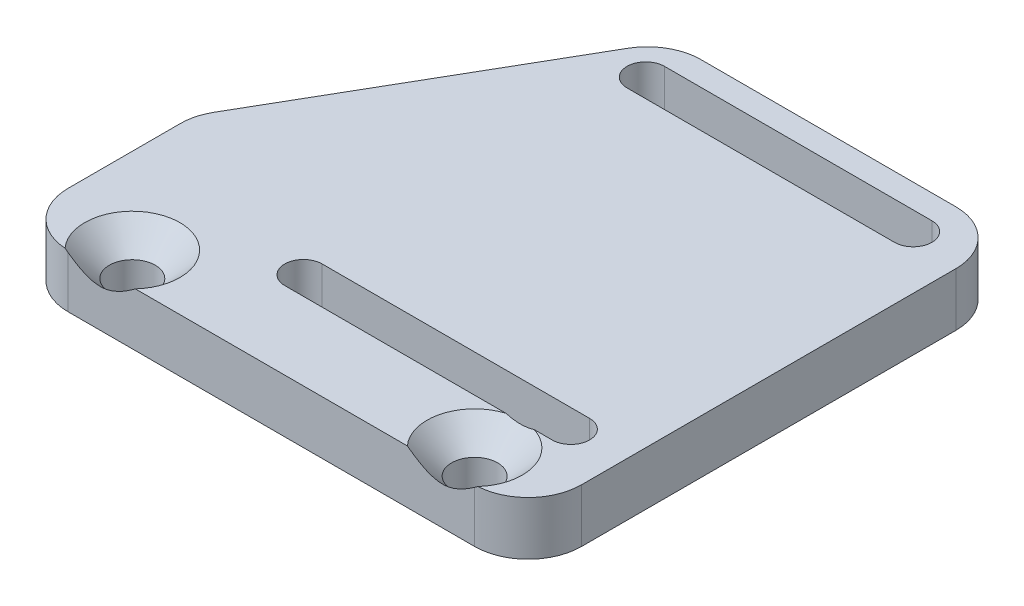
ISO-10303-21;
HEADER;
FILE_DESCRIPTION(('STEP AP214'),'2;1');
FILE_NAME('part.step','',(''),(''),'','','');
FILE_SCHEMA(('AUTOMOTIVE_DESIGN { 1 0 10303 214 1 1 1 1 }'));
ENDSEC;
DATA;
#1=APPLICATION_CONTEXT('core data for automotive mechanical design processes');
#2=APPLICATION_PROTOCOL_DEFINITION('international standard','automotive_design',2000,#1);
#3=PRODUCT_CONTEXT('',#1,'mechanical');
#4=PRODUCT('Part','Part','',(#3));
#5=PRODUCT_RELATED_PRODUCT_CATEGORY('part','',(#4));
#6=PRODUCT_DEFINITION_FORMATION('','',#4);
#7=PRODUCT_DEFINITION_CONTEXT('part definition',#1,'design');
#8=PRODUCT_DEFINITION('design','',#6,#7);
#9=PRODUCT_DEFINITION_SHAPE('','',#8);
#10=(LENGTH_UNIT() NAMED_UNIT(*) SI_UNIT(.MILLI.,.METRE.));
#11=(NAMED_UNIT(*) PLANE_ANGLE_UNIT() SI_UNIT($,.RADIAN.));
#12=(NAMED_UNIT(*) SI_UNIT($,.STERADIAN.) SOLID_ANGLE_UNIT());
#13=UNCERTAINTY_MEASURE_WITH_UNIT(LENGTH_MEASURE(1.E-05),#10,'distance_accuracy_value','');
#14=(GEOMETRIC_REPRESENTATION_CONTEXT(3) GLOBAL_UNCERTAINTY_ASSIGNED_CONTEXT((#13)) GLOBAL_UNIT_ASSIGNED_CONTEXT((#10,
#11,#12)) REPRESENTATION_CONTEXT('',''));
#15=CARTESIAN_POINT('',(0.,0.,0.));
#16=DIRECTION('',(0.,0.,1.));
#17=DIRECTION('',(1.,0.,0.));
#18=AXIS2_PLACEMENT_3D('',#15,#16,#17);
#19=CARTESIAN_POINT('',(0.,5.,0.));
#20=DIRECTION('',(0.,1.,0.));
#21=DIRECTION('',(0.,0.,1.));
#22=AXIS2_PLACEMENT_3D('',#19,#20,#21);
#23=PLANE('',#22);
#24=DIRECTION('',(1.,0.,0.));
#25=VECTOR('',#24,1.);
#26=CARTESIAN_POINT('',(-30.,5.,-7.24999999999999));
#27=LINE('',#26,#25);
#28=CARTESIAN_POINT('',(-6.68090940417267,5.,-7.25));
#29=VERTEX_POINT('',#28);
#30=CARTESIAN_POINT('',(-5.,5.,-7.25));
#31=VERTEX_POINT('',#30);
#32=EDGE_CURVE('E261',#29,#31,#27,.T.);
#33=ORIENTED_EDGE('',*,*,#32,.F.);
#34=CARTESIAN_POINT('',(-8.,5.,-2.99999999999999));
#35=DIRECTION('',(0.,1.,0.));
#36=DIRECTION('',(0.,0.,1.));
#37=AXIS2_PLACEMENT_3D('',#34,#35,#36);
#38=CIRCLE('',#37,4.45000000000002);
#39=CARTESIAN_POINT('',(-4.70537528035909,5.,-0.00868792053867681));
#40=VERTEX_POINT('',#39);
#41=EDGE_CURVE('E418',#29,#40,#38,.F.);
#42=ORIENTED_EDGE('',*,*,#41,.T.);
#43=CARTESIAN_POINT('',(-5.,5.,-5.));
#44=DIRECTION('',(0.,1.,0.));
#45=DIRECTION('',(0.,0.,1.));
#46=AXIS2_PLACEMENT_3D('',#43,#44,#45);
#47=CIRCLE('',#46,5.);
#48=CARTESIAN_POINT('',(0.,5.,-5.));
#49=VERTEX_POINT('',#48);
#50=EDGE_CURVE('E360',#40,#49,#47,.T.);
#51=ORIENTED_EDGE('',*,*,#50,.T.);
#52=DIRECTION('',(0.,0.,-1.));
#53=VECTOR('',#52,1.);
#54=CARTESIAN_POINT('',(0.,5.,0.));
#55=LINE('',#54,#53);
#56=CARTESIAN_POINT('',(0.,5.,-40.));
#57=VERTEX_POINT('',#56);
#58=EDGE_CURVE('E311',#49,#57,#55,.T.);
#59=ORIENTED_EDGE('',*,*,#58,.T.);
#60=CARTESIAN_POINT('',(-5.,5.,-40.));
#61=DIRECTION('',(0.,1.,0.));
#62=DIRECTION('',(0.,0.,1.));
#63=AXIS2_PLACEMENT_3D('',#60,#61,#62);
#64=CIRCLE('',#63,5.);
#65=CARTESIAN_POINT('',(-5.,5.,-45.));
#66=VERTEX_POINT('',#65);
#67=EDGE_CURVE('E350',#57,#66,#64,.T.);
#68=ORIENTED_EDGE('',*,*,#67,.T.);
#69=DIRECTION('',(-1.,0.,0.));
#70=VECTOR('',#69,1.);
#71=CARTESIAN_POINT('',(0.,5.,-45.));
#72=LINE('',#71,#70);
#73=CARTESIAN_POINT('',(-28.8452994616208,5.,-45.));
#74=VERTEX_POINT('',#73);
#75=EDGE_CURVE('E315',#66,#74,#72,.T.);
#76=ORIENTED_EDGE('',*,*,#75,.T.);
#77=CARTESIAN_POINT('',(-28.8452994616208,5.,-40.));
#78=DIRECTION('',(0.,1.,0.));
#79=DIRECTION('',(0.,0.,1.));
#80=AXIS2_PLACEMENT_3D('',#77,#78,#79);
#81=CIRCLE('',#80,5.);
#82=CARTESIAN_POINT('',(-33.1754264805429,5.,-42.5));
#83=VERTEX_POINT('',#82);
#84=EDGE_CURVE('E363',#74,#83,#81,.T.);
#85=ORIENTED_EDGE('',*,*,#84,.T.);
#86=DIRECTION('',(0.500000000000004,0.,-0.866025403784436));
#87=VECTOR('',#86,1.);
#88=CARTESIAN_POINT('',(-43.2846096908265,5.,-24.9903810567668));
#89=LINE('',#88,#87);
#90=CARTESIAN_POINT('',(-47.3301270189222,5.,-17.9833395016049));
#91=VERTEX_POINT('',#90);
#92=EDGE_CURVE('E241',#91,#83,#89,.T.);
#93=ORIENTED_EDGE('',*,*,#92,.F.);
#94=CARTESIAN_POINT('',(-43.,5.,-15.4833395016049));
#95=DIRECTION('',(0.,1.,0.));
#96=DIRECTION('',(0.,0.,1.));
#97=AXIS2_PLACEMENT_3D('',#94,#95,#96);
#98=CIRCLE('',#97,5.);
#99=CARTESIAN_POINT('',(-48.,5.,-15.4833395016049));
#100=VERTEX_POINT('',#99);
#101=EDGE_CURVE('E353',#91,#100,#98,.T.);
#102=ORIENTED_EDGE('',*,*,#101,.T.);
#103=DIRECTION('',(0.,0.,1.));
#104=VECTOR('',#103,1.);
#105=CARTESIAN_POINT('',(-48.,5.,0.));
#106=LINE('',#105,#104);
#107=CARTESIAN_POINT('',(-48.,5.,-4.99999999999999));
#108=VERTEX_POINT('',#107);
#109=EDGE_CURVE('E320',#100,#108,#106,.T.);
#110=ORIENTED_EDGE('',*,*,#109,.T.);
#111=CARTESIAN_POINT('',(-43.,5.,-4.99999999999999));
#112=DIRECTION('',(0.,1.,0.));
#113=DIRECTION('',(0.,0.,1.));
#114=AXIS2_PLACEMENT_3D('',#111,#112,#113);
#115=CIRCLE('',#114,5.);
#116=CARTESIAN_POINT('',(-43.2946247196409,5.,-0.00868792053867074));
#117=VERTEX_POINT('',#116);
#118=EDGE_CURVE('E356',#108,#117,#115,.T.);
#119=ORIENTED_EDGE('',*,*,#118,.T.);
#120=CARTESIAN_POINT('',(-40.,5.,-2.99999999999999));
#121=DIRECTION('',(0.,1.,0.));
#122=DIRECTION('',(0.,0.,1.));
#123=AXIS2_PLACEMENT_3D('',#120,#121,#122);
#124=CIRCLE('',#123,4.45000000000001);
#125=CARTESIAN_POINT('',(-36.713284314091,5.,0.));
#126=VERTEX_POINT('',#125);
#127=EDGE_CURVE('E411',#117,#126,#124,.F.);
#128=ORIENTED_EDGE('',*,*,#127,.T.);
#129=DIRECTION('',(1.,0.,0.));
#130=VECTOR('',#129,1.);
#131=CARTESIAN_POINT('',(0.,5.,0.));
#132=LINE('',#131,#130);
#133=CARTESIAN_POINT('',(-11.286715685909,5.,0.));
#134=VERTEX_POINT('',#133);
#135=EDGE_CURVE('E324',#126,#134,#132,.T.);
#136=ORIENTED_EDGE('',*,*,#135,.T.);
#137=CARTESIAN_POINT('',(-8.,5.,-2.99999999999999));
#138=DIRECTION('',(0.,1.,0.));
#139=DIRECTION('',(0.,0.,1.));
#140=AXIS2_PLACEMENT_3D('',#137,#138,#139);
#141=CIRCLE('',#140,4.45000000000002);
#142=CARTESIAN_POINT('',(-9.31909059582734,5.,-7.25));
#143=VERTEX_POINT('',#142);
#144=EDGE_CURVE('E415',#134,#143,#141,.F.);
#145=ORIENTED_EDGE('',*,*,#144,.T.);
#146=CARTESIAN_POINT('',(-30.,5.,-7.24999999999999));
#147=VERTEX_POINT('',#146);
#148=EDGE_CURVE('E263',#147,#143,#27,.T.);
#149=ORIENTED_EDGE('',*,*,#148,.F.);
#150=CARTESIAN_POINT('',(-30.,5.,-8.99999999999999));
#151=DIRECTION('',(0.,1.,0.));
#152=DIRECTION('',(0.,0.,1.));
#153=AXIS2_PLACEMENT_3D('',#150,#151,#152);
#154=CIRCLE('',#153,1.75);
#155=CARTESIAN_POINT('',(-30.,5.,-10.75));
#156=VERTEX_POINT('',#155);
#157=EDGE_CURVE('E258',#156,#147,#154,.T.);
#158=ORIENTED_EDGE('',*,*,#157,.F.);
#159=DIRECTION('',(-1.,0.,0.));
#160=VECTOR('',#159,1.);
#161=CARTESIAN_POINT('',(-30.,5.,-10.75));
#162=LINE('',#161,#160);
#163=CARTESIAN_POINT('',(-5.,5.,-10.75));
#164=VERTEX_POINT('',#163);
#165=EDGE_CURVE('E271',#164,#156,#162,.T.);
#166=ORIENTED_EDGE('',*,*,#165,.F.);
#167=CARTESIAN_POINT('',(-5.,5.,-9.));
#168=DIRECTION('',(0.,1.,0.));
#169=DIRECTION('',(0.,0.,1.));
#170=AXIS2_PLACEMENT_3D('',#167,#168,#169);
#171=CIRCLE('',#170,1.75);
#172=EDGE_CURVE('E267',#31,#164,#171,.T.);
#173=ORIENTED_EDGE('',*,*,#172,.F.);
#174=EDGE_LOOP('',(#33,#42,#51,#59,#68,#76,#85,#93,#102,#110,#119,#128,#136,#145,#149,#158,#166,#173));
#175=FACE_BOUND('',#174,.T.);
#176=DIRECTION('',(1.,0.,0.));
#177=VECTOR('',#176,1.);
#178=CARTESIAN_POINT('',(-30.,5.,-39.25));
#179=LINE('',#178,#177);
#180=CARTESIAN_POINT('',(-30.,5.,-39.25));
#181=VERTEX_POINT('',#180);
#182=CARTESIAN_POINT('',(-5.00000000000001,5.,-39.25));
#183=VERTEX_POINT('',#182);
#184=EDGE_CURVE('E214',#181,#183,#179,.T.);
#185=ORIENTED_EDGE('',*,*,#184,.F.);
#186=CARTESIAN_POINT('',(-30.,5.,-41.));
#187=DIRECTION('',(0.,1.,0.));
#188=DIRECTION('',(0.,0.,1.));
#189=AXIS2_PLACEMENT_3D('',#186,#187,#188);
#190=CIRCLE('',#189,1.75);
#191=CARTESIAN_POINT('',(-30.,5.,-42.75));
#192=VERTEX_POINT('',#191);
#193=EDGE_CURVE('E203',#192,#181,#190,.T.);
#194=ORIENTED_EDGE('',*,*,#193,.F.);
#195=DIRECTION('',(-1.,0.,0.));
#196=VECTOR('',#195,1.);
#197=CARTESIAN_POINT('',(-30.,5.,-42.75));
#198=LINE('',#197,#196);
#199=CARTESIAN_POINT('',(-5.00000000000001,5.,-42.75));
#200=VERTEX_POINT('',#199);
#201=EDGE_CURVE('E232',#200,#192,#198,.T.);
#202=ORIENTED_EDGE('',*,*,#201,.F.);
#203=CARTESIAN_POINT('',(-5.00000000000001,5.,-41.));
#204=DIRECTION('',(0.,1.,0.));
#205=DIRECTION('',(0.,0.,1.));
#206=AXIS2_PLACEMENT_3D('',#203,#204,#205);
#207=CIRCLE('',#206,1.75);
#208=EDGE_CURVE('E228',#183,#200,#207,.T.);
#209=ORIENTED_EDGE('',*,*,#208,.F.);
#210=EDGE_LOOP('',(#185,#194,#202,#209));
#211=FACE_BOUND('',#210,.T.);
#212=ADVANCED_FACE('F51',(#175,#211),#23,.T.);
#213=CARTESIAN_POINT('',(0.,0.,0.));
#214=DIRECTION('',(0.,1.,0.));
#215=DIRECTION('',(0.,0.,1.));
#216=AXIS2_PLACEMENT_3D('',#213,#214,#215);
#217=PLANE('',#216);
#218=CARTESIAN_POINT('',(-30.,0.,-8.99999999999999));
#219=DIRECTION('',(0.,1.,0.));
#220=DIRECTION('',(0.,0.,1.));
#221=AXIS2_PLACEMENT_3D('',#218,#219,#220);
#222=CIRCLE('',#221,1.75);
#223=CARTESIAN_POINT('',(-30.,0.,-10.75));
#224=VERTEX_POINT('',#223);
#225=CARTESIAN_POINT('',(-30.,0.,-7.24999999999999));
#226=VERTEX_POINT('',#225);
#227=EDGE_CURVE('E223',#224,#226,#222,.T.);
#228=ORIENTED_EDGE('',*,*,#227,.T.);
#229=DIRECTION('',(1.,0.,0.));
#230=VECTOR('',#229,1.);
#231=CARTESIAN_POINT('',(-30.,0.,-7.24999999999999));
#232=LINE('',#231,#230);
#233=CARTESIAN_POINT('',(-5.,0.,-7.25));
#234=VERTEX_POINT('',#233);
#235=EDGE_CURVE('E278',#226,#234,#232,.T.);
#236=ORIENTED_EDGE('',*,*,#235,.T.);
#237=CARTESIAN_POINT('',(-5.,0.,-9.));
#238=DIRECTION('',(0.,1.,0.));
#239=DIRECTION('',(0.,0.,1.));
#240=AXIS2_PLACEMENT_3D('',#237,#238,#239);
#241=CIRCLE('',#240,1.75);
#242=CARTESIAN_POINT('',(-5.,0.,-10.75));
#243=VERTEX_POINT('',#242);
#244=EDGE_CURVE('E282',#234,#243,#241,.T.);
#245=ORIENTED_EDGE('',*,*,#244,.T.);
#246=DIRECTION('',(-1.,0.,0.));
#247=VECTOR('',#246,1.);
#248=CARTESIAN_POINT('',(-30.,0.,-10.75));
#249=LINE('',#248,#247);
#250=EDGE_CURVE('E262',#243,#224,#249,.T.);
#251=ORIENTED_EDGE('',*,*,#250,.T.);
#252=EDGE_LOOP('',(#228,#236,#245,#251));
#253=FACE_BOUND('',#252,.T.);
#254=DIRECTION('',(0.500000000000004,0.,-0.866025403784436));
#255=VECTOR('',#254,1.);
#256=CARTESIAN_POINT('',(-31.7320508075689,0.,-45.));
#257=LINE('',#256,#255);
#258=CARTESIAN_POINT('',(-47.3301270189222,0.,-17.9833395016049));
#259=VERTEX_POINT('',#258);
#260=CARTESIAN_POINT('',(-33.1754264805429,0.,-42.5));
#261=VERTEX_POINT('',#260);
#262=EDGE_CURVE('E663',#259,#261,#257,.T.);
#263=ORIENTED_EDGE('',*,*,#262,.T.);
#264=CARTESIAN_POINT('',(-28.8452994616208,0.,-40.));
#265=DIRECTION('',(0.,1.,0.));
#266=DIRECTION('',(0.,0.,1.));
#267=AXIS2_PLACEMENT_3D('',#264,#265,#266);
#268=CIRCLE('',#267,5.);
#269=CARTESIAN_POINT('',(-28.8452994616208,0.,-45.));
#270=VERTEX_POINT('',#269);
#271=EDGE_CURVE('E385',#261,#270,#268,.F.);
#272=ORIENTED_EDGE('',*,*,#271,.T.);
#273=DIRECTION('',(-1.,0.,0.));
#274=VECTOR('',#273,1.);
#275=CARTESIAN_POINT('',(0.,0.,-45.));
#276=LINE('',#275,#274);
#277=CARTESIAN_POINT('',(-5.,0.,-45.));
#278=VERTEX_POINT('',#277);
#279=EDGE_CURVE('E332',#278,#270,#276,.T.);
#280=ORIENTED_EDGE('',*,*,#279,.F.);
#281=CARTESIAN_POINT('',(-5.,0.,-40.));
#282=DIRECTION('',(0.,1.,0.));
#283=DIRECTION('',(0.,0.,1.));
#284=AXIS2_PLACEMENT_3D('',#281,#282,#283);
#285=CIRCLE('',#284,5.);
#286=CARTESIAN_POINT('',(0.,0.,-40.));
#287=VERTEX_POINT('',#286);
#288=EDGE_CURVE('E373',#278,#287,#285,.F.);
#289=ORIENTED_EDGE('',*,*,#288,.T.);
#290=DIRECTION('',(0.,0.,-1.));
#291=VECTOR('',#290,1.);
#292=CARTESIAN_POINT('',(0.,0.,0.));
#293=LINE('',#292,#291);
#294=CARTESIAN_POINT('',(0.,0.,-5.));
#295=VERTEX_POINT('',#294);
#296=EDGE_CURVE('E310',#295,#287,#293,.T.);
#297=ORIENTED_EDGE('',*,*,#296,.F.);
#298=CARTESIAN_POINT('',(-5.,0.,-5.));
#299=DIRECTION('',(0.,1.,0.));
#300=DIRECTION('',(0.,0.,1.));
#301=AXIS2_PLACEMENT_3D('',#298,#299,#300);
#302=CIRCLE('',#301,5.);
#303=CARTESIAN_POINT('',(-5.,0.,0.));
#304=VERTEX_POINT('',#303);
#305=EDGE_CURVE('E382',#295,#304,#302,.F.);
#306=ORIENTED_EDGE('',*,*,#305,.T.);
#307=DIRECTION('',(1.,0.,0.));
#308=VECTOR('',#307,1.);
#309=CARTESIAN_POINT('',(0.,0.,0.));
#310=LINE('',#309,#308);
#311=CARTESIAN_POINT('',(-43.,0.,0.));
#312=VERTEX_POINT('',#311);
#313=EDGE_CURVE('E316',#312,#304,#310,.T.);
#314=ORIENTED_EDGE('',*,*,#313,.F.);
#315=CARTESIAN_POINT('',(-43.,0.,-4.99999999999999));
#316=DIRECTION('',(0.,1.,0.));
#317=DIRECTION('',(0.,0.,1.));
#318=AXIS2_PLACEMENT_3D('',#315,#316,#317);
#319=CIRCLE('',#318,5.);
#320=CARTESIAN_POINT('',(-48.,0.,-4.99999999999999));
#321=VERTEX_POINT('',#320);
#322=EDGE_CURVE('E379',#312,#321,#319,.F.);
#323=ORIENTED_EDGE('',*,*,#322,.T.);
#324=DIRECTION('',(0.,0.,1.));
#325=VECTOR('',#324,1.);
#326=CARTESIAN_POINT('',(-48.,0.,0.));
#327=LINE('',#326,#325);
#328=CARTESIAN_POINT('',(-48.,0.,-15.4833395016049));
#329=VERTEX_POINT('',#328);
#330=EDGE_CURVE('E336',#329,#321,#327,.T.);
#331=ORIENTED_EDGE('',*,*,#330,.F.);
#332=CARTESIAN_POINT('',(-43.,0.,-15.4833395016049));
#333=DIRECTION('',(0.,1.,0.));
#334=DIRECTION('',(0.,0.,1.));
#335=AXIS2_PLACEMENT_3D('',#332,#333,#334);
#336=CIRCLE('',#335,5.);
#337=EDGE_CURVE('E376',#329,#259,#336,.F.);
#338=ORIENTED_EDGE('',*,*,#337,.T.);
#339=EDGE_LOOP('',(#263,#272,#280,#289,#297,#306,#314,#323,#331,#338));
#340=FACE_BOUND('',#339,.T.);
#341=CARTESIAN_POINT('',(-40.,0.,-2.99999999999999));
#342=DIRECTION('',(0.,1.,0.));
#343=DIRECTION('',(0.,0.,1.));
#344=AXIS2_PLACEMENT_3D('',#341,#342,#343);
#345=CIRCLE('',#344,2.15);
#346=CARTESIAN_POINT('',(-40.,0.,-0.849999999999994));
#347=VERTEX_POINT('',#346);
#348=EDGE_CURVE('E306',#347,#347,#345,.T.);
#349=ORIENTED_EDGE('',*,*,#348,.T.);
#350=EDGE_LOOP('',(#349));
#351=FACE_BOUND('',#350,.T.);
#352=CARTESIAN_POINT('',(-8.,0.,-2.99999999999999));
#353=DIRECTION('',(0.,1.,0.));
#354=DIRECTION('',(0.,0.,1.));
#355=AXIS2_PLACEMENT_3D('',#352,#353,#354);
#356=CIRCLE('',#355,2.15);
#357=CARTESIAN_POINT('',(-8.,0.,-0.849999999999993));
#358=VERTEX_POINT('',#357);
#359=EDGE_CURVE('E302',#358,#358,#356,.T.);
#360=ORIENTED_EDGE('',*,*,#359,.T.);
#361=EDGE_LOOP('',(#360));
#362=FACE_BOUND('',#361,.T.);
#363=CARTESIAN_POINT('',(-30.,0.,-41.));
#364=DIRECTION('',(0.,1.,0.));
#365=DIRECTION('',(0.,0.,1.));
#366=AXIS2_PLACEMENT_3D('',#363,#364,#365);
#367=CIRCLE('',#366,1.75);
#368=CARTESIAN_POINT('',(-30.,0.,-42.75));
#369=VERTEX_POINT('',#368);
#370=CARTESIAN_POINT('',(-30.,0.,-39.25));
#371=VERTEX_POINT('',#370);
#372=EDGE_CURVE('E238',#369,#371,#367,.T.);
#373=ORIENTED_EDGE('',*,*,#372,.T.);
#374=DIRECTION('',(1.,0.,0.));
#375=VECTOR('',#374,1.);
#376=CARTESIAN_POINT('',(-30.,0.,-39.25));
#377=LINE('',#376,#375);
#378=CARTESIAN_POINT('',(-5.00000000000001,0.,-39.25));
#379=VERTEX_POINT('',#378);
#380=EDGE_CURVE('E221',#371,#379,#377,.T.);
#381=ORIENTED_EDGE('',*,*,#380,.T.);
#382=CARTESIAN_POINT('',(-5.00000000000001,0.,-41.));
#383=DIRECTION('',(0.,1.,0.));
#384=DIRECTION('',(0.,0.,1.));
#385=AXIS2_PLACEMENT_3D('',#382,#383,#384);
#386=CIRCLE('',#385,1.75);
#387=CARTESIAN_POINT('',(-5.00000000000001,0.,-42.75));
#388=VERTEX_POINT('',#387);
#389=EDGE_CURVE('E244',#379,#388,#386,.T.);
#390=ORIENTED_EDGE('',*,*,#389,.T.);
#391=DIRECTION('',(-1.,0.,0.));
#392=VECTOR('',#391,1.);
#393=CARTESIAN_POINT('',(-30.,0.,-42.75));
#394=LINE('',#393,#392);
#395=EDGE_CURVE('E215',#388,#369,#394,.T.);
#396=ORIENTED_EDGE('',*,*,#395,.T.);
#397=EDGE_LOOP('',(#373,#381,#390,#396));
#398=FACE_BOUND('',#397,.T.);
#399=ADVANCED_FACE('F470',(#253,#340,#351,#362,#398),#217,.F.);
#400=CARTESIAN_POINT('',(0.,5.,0.));
#401=DIRECTION('',(-1.,0.,0.));
#402=DIRECTION('',(0.,0.,1.));
#403=AXIS2_PLACEMENT_3D('',#400,#401,#402);
#404=PLANE('',#403);
#405=ORIENTED_EDGE('',*,*,#58,.F.);
#406=DIRECTION('',(0.,-1.,0.));
#407=VECTOR('',#406,1.);
#408=CARTESIAN_POINT('',(0.,5.,-5.));
#409=LINE('',#408,#407);
#410=EDGE_CURVE('E391',#49,#295,#409,.T.);
#411=ORIENTED_EDGE('',*,*,#410,.T.);
#412=ORIENTED_EDGE('',*,*,#296,.T.);
#413=DIRECTION('',(0.,-1.,0.));
#414=VECTOR('',#413,1.);
#415=CARTESIAN_POINT('',(0.,5.,-40.));
#416=LINE('',#415,#414);
#417=EDGE_CURVE('E388',#287,#57,#416,.F.);
#418=ORIENTED_EDGE('',*,*,#417,.T.);
#419=EDGE_LOOP('',(#405,#411,#412,#418));
#420=FACE_BOUND('',#419,.T.);
#421=ADVANCED_FACE('F479',(#420),#404,.F.);
#422=CARTESIAN_POINT('',(0.,5.,-45.));
#423=DIRECTION('',(0.,0.,1.));
#424=DIRECTION('',(1.,0.,0.));
#425=AXIS2_PLACEMENT_3D('',#422,#423,#424);
#426=PLANE('',#425);
#427=ORIENTED_EDGE('',*,*,#279,.T.);
#428=DIRECTION('',(0.,1.,0.));
#429=VECTOR('',#428,1.);
#430=CARTESIAN_POINT('',(-28.8452994616208,5.,-45.));
#431=LINE('',#430,#429);
#432=EDGE_CURVE('E346',#270,#74,#431,.T.);
#433=ORIENTED_EDGE('',*,*,#432,.T.);
#434=ORIENTED_EDGE('',*,*,#75,.F.);
#435=DIRECTION('',(0.,-1.,0.));
#436=VECTOR('',#435,1.);
#437=CARTESIAN_POINT('',(-5.,5.,-45.));
#438=LINE('',#437,#436);
#439=EDGE_CURVE('E328',#66,#278,#438,.T.);
#440=ORIENTED_EDGE('',*,*,#439,.T.);
#441=EDGE_LOOP('',(#427,#433,#434,#440));
#442=FACE_BOUND('',#441,.T.);
#443=ADVANCED_FACE('F475',(#442),#426,.F.);
#444=CARTESIAN_POINT('',(-48.,5.,0.));
#445=DIRECTION('',(1.,0.,0.));
#446=DIRECTION('',(0.,0.,-1.));
#447=AXIS2_PLACEMENT_3D('',#444,#445,#446);
#448=PLANE('',#447);
#449=ORIENTED_EDGE('',*,*,#330,.T.);
#450=DIRECTION('',(0.,-1.,0.));
#451=VECTOR('',#450,1.);
#452=CARTESIAN_POINT('',(-48.,5.,-4.99999999999999));
#453=LINE('',#452,#451);
#454=EDGE_CURVE('E404',#321,#108,#453,.F.);
#455=ORIENTED_EDGE('',*,*,#454,.T.);
#456=ORIENTED_EDGE('',*,*,#109,.F.);
#457=DIRECTION('',(0.,1.,0.));
#458=VECTOR('',#457,1.);
#459=CARTESIAN_POINT('',(-48.,5.,-15.4833395016049));
#460=LINE('',#459,#458);
#461=EDGE_CURVE('E401',#100,#329,#460,.F.);
#462=ORIENTED_EDGE('',*,*,#461,.T.);
#463=EDGE_LOOP('',(#449,#455,#456,#462));
#464=FACE_BOUND('',#463,.T.);
#465=ADVANCED_FACE('F469',(#464),#448,.F.);
#466=CARTESIAN_POINT('',(0.,5.,0.));
#467=DIRECTION('',(0.,0.,-1.));
#468=DIRECTION('',(-1.,0.,0.));
#469=AXIS2_PLACEMENT_3D('',#466,#467,#468);
#470=PLANE('',#469);
#471=DIRECTION('',(0.,-1.,0.));
#472=VECTOR('',#471,1.);
#473=CARTESIAN_POINT('',(-5.,5.,0.));
#474=LINE('',#473,#472);
#475=CARTESIAN_POINT('',(-5.,4.79264068711926,0.));
#476=VERTEX_POINT('',#475);
#477=EDGE_CURVE('E398',#304,#476,#474,.F.);
#478=ORIENTED_EDGE('',*,*,#477,.T.);
#479=CARTESIAN_POINT('',(-5.,4.79264068711926,0.));
#480=CARTESIAN_POINT('',(-5.08384870030974,4.73337004107153,0.));
#481=CARTESIAN_POINT('',(-5.16827408607277,4.67489705835825,0.));
#482=CARTESIAN_POINT('',(-5.33851363265359,4.55992814659262,0.));
#483=CARTESIAN_POINT('',(-5.42432840085305,4.50343311832706,0.));
#484=CARTESIAN_POINT('',(-5.59858856551886,4.39216532424083,0.));
#485=CARTESIAN_POINT('',(-5.68705343140295,4.33742288259951,0.));
#486=CARTESIAN_POINT('',(-5.86579093484533,4.23099015030672,0.));
#487=CARTESIAN_POINT('',(-5.95606336430836,4.17929951099209,0.));
#488=CARTESIAN_POINT('',(-6.1415437212809,4.07812076820471,0.));
#489=CARTESIAN_POINT('',(-6.23681771180125,4.02875208537611,0.));
#490=CARTESIAN_POINT('',(-6.42978953532272,3.93503019829929,0.));
#491=CARTESIAN_POINT('',(-6.52748782419332,3.89067794619944,0.));
#492=CARTESIAN_POINT('',(-6.82362383832555,3.76742885709321,0.));
#493=CARTESIAN_POINT('',(-7.02622223639912,3.6976974731734,0.));
#494=CARTESIAN_POINT('',(-7.33133786018356,3.62214632282189,0.));
#495=CARTESIAN_POINT('',(-7.43035463394783,3.60200951765351,0.));
#496=CARTESIAN_POINT('',(-7.62990823579772,3.5711367738145,0.));
#497=CARTESIAN_POINT('',(-7.73044538814918,3.56040287019827,0.));
#498=CARTESIAN_POINT('',(-7.93065334059994,3.54916050669773,0.));
#499=CARTESIAN_POINT('',(-8.0303159724362,3.54850802654483,0.));
#500=CARTESIAN_POINT('',(-8.22920716817284,3.55710203908714,0.));
#501=CARTESIAN_POINT('',(-8.32843572873537,3.56634860776867,0.));
#502=CARTESIAN_POINT('',(-8.52484256647002,3.59402130651985,0.));
#503=CARTESIAN_POINT('',(-8.62203050817816,3.61238015886653,0.));
#504=CARTESIAN_POINT('',(-8.81452782260945,3.65719841906825,0.));
#505=CARTESIAN_POINT('',(-8.90983648291838,3.68366083835854,0.));
#506=CARTESIAN_POINT('',(-9.09957464832775,3.74387669740474,0.));
#507=CARTESIAN_POINT('',(-9.19397281098106,3.77772767596643,0.));
#508=CARTESIAN_POINT('',(-9.38043963447864,3.85125382484663,0.));
#509=CARTESIAN_POINT('',(-9.47250839038056,3.89092875705233,0.));
#510=CARTESIAN_POINT('',(-9.72001523230427,4.00530398546658,0.));
#511=CARTESIAN_POINT('',(-9.8733045871472,4.08464029555377,0.));
#512=CARTESIAN_POINT('',(-10.1745125212031,4.25309577074375,0.));
#513=CARTESIAN_POINT('',(-10.3224246822087,4.3422261467621,0.));
#514=CARTESIAN_POINT('',(-10.6083042117926,4.5238583164675,0.));
#515=CARTESIAN_POINT('',(-10.7464359069822,4.61610336766505,0.));
#516=CARTESIAN_POINT('',(-10.9509885079199,4.75784259850726,0.));
#517=CARTESIAN_POINT('',(-11.0186392197736,4.80558192172179,0.));
#518=CARTESIAN_POINT('',(-11.1532051909965,4.90206952499881,0.));
#519=CARTESIAN_POINT('',(-11.2201205397631,4.95081768029376,0.));
#520=CARTESIAN_POINT('',(-11.286715685909,5.,0.));
#521=B_SPLINE_CURVE_WITH_KNOTS('',3,(#479,#480,#481,#482,#483,#484,#485,#486,#487,#488,#489,
#490,#491,#492,#493,#494,#495,#496,#497,#498,#499,#500,#501,#502,#503,#504,#505,#506,#507,#508,
#509,#510,#511,#512,#513,#514,#515,#516,#517,#518,#519,#520),.UNSPECIFIED.,.F.,.F.,(4,2,2,2,2,2,
2,2,2,2,2,2,2,2,2,2,2,2,2,2,4),(0.,0.308056984857708,0.616252484844291,0.928297335940571,
1.24030646718564,1.56207232915209,1.88389916206309,2.52369889571531,2.82646080516549,
3.12928822469613,3.42778547472503,3.72628501607177,4.02261274784697,4.31905073439516,
4.61966833398523,4.92027364622183,5.43751529563899,5.95535530504847,6.4535212554354,
6.70191123653112,6.9502706793841),.UNSPECIFIED.);
#522=EDGE_CURVE('E451',#476,#134,#521,.T.);
#523=ORIENTED_EDGE('',*,*,#522,.T.);
#524=ORIENTED_EDGE('',*,*,#135,.F.);
#525=CARTESIAN_POINT('',(-36.713284314091,5.,0.));
#526=CARTESIAN_POINT('',(-36.7989772881778,4.9367257941357,0.));
#527=CARTESIAN_POINT('',(-36.8851978611663,4.87415289107529,0.));
#528=CARTESIAN_POINT('',(-37.0589124802977,4.75074004186506,0.));
#529=CARTESIAN_POINT('',(-37.1464069450212,4.68990068567759,0.));
#530=CARTESIAN_POINT('',(-37.3237466773382,4.56970719017193,0.));
#531=CARTESIAN_POINT('',(-37.4136069241202,4.5103750477118,0.));
#532=CARTESIAN_POINT('',(-37.5950122118191,4.39435960050932,0.));
#533=CARTESIAN_POINT('',(-37.6865570991104,4.33767605588831,0.));
#534=CARTESIAN_POINT('',(-37.8761698326121,4.22485559535131,0.));
#535=CARTESIAN_POINT('',(-37.9743368507103,4.16888317880411,0.));
#536=CARTESIAN_POINT('',(-38.1731159028577,4.0614828907598,0.));
#537=CARTESIAN_POINT('',(-38.2737284039659,4.01005589622075,0.));
#538=CARTESIAN_POINT('',(-38.5789220392331,3.86473960963396,0.));
#539=CARTESIAN_POINT('',(-38.7878164521148,3.77921957840748,0.));
#540=CARTESIAN_POINT('',(-39.103054162919,3.67976365119637,0.));
#541=CARTESIAN_POINT('',(-39.2050238986769,3.65191832108074,0.));
#542=CARTESIAN_POINT('',(-39.4111289787465,3.60560007929203,0.));
#543=CARTESIAN_POINT('',(-39.5152644568258,3.58712774834506,0.));
#544=CARTESIAN_POINT('',(-39.7230684620277,3.561023463921,0.));
#545=CARTESIAN_POINT('',(-39.8267136297425,3.55320862179467,0.));
#546=CARTESIAN_POINT('',(-40.0342553131466,3.54840196490856,0.));
#547=CARTESIAN_POINT('',(-40.1381518132006,3.55140949335661,0.));
#548=CARTESIAN_POINT('',(-40.3449075518226,3.56800462675939,0.));
#549=CARTESIAN_POINT('',(-40.4477682012513,3.58157503625639,0.));
#550=CARTESIAN_POINT('',(-40.6517419165406,3.61833664290487,0.));
#551=CARTESIAN_POINT('',(-40.7528546417031,3.64152969411913,0.));
#552=CARTESIAN_POINT('',(-40.9543829610241,3.69663169322628,0.));
#553=CARTESIAN_POINT('',(-41.0547614507112,3.72867429082053,0.));
#554=CARTESIAN_POINT('',(-41.2529470803935,3.79981843019547,0.));
#555=CARTESIAN_POINT('',(-41.3507542124281,3.83891999382674,0.));
#556=CARTESIAN_POINT('',(-41.5877349768458,3.94188374214547,0.));
#557=CARTESIAN_POINT('',(-41.725519480078,4.00892554701117,0.));
#558=CARTESIAN_POINT('',(-41.9965276937193,4.15178512268366,0.));
#559=CARTESIAN_POINT('',(-42.1297471133026,4.22761087158394,0.));
#560=CARTESIAN_POINT('',(-42.3875211776833,4.38276178683884,0.));
#561=CARTESIAN_POINT('',(-42.5122145997543,4.46185815932319,0.));
#562=CARTESIAN_POINT('',(-42.6968814311403,4.58373867899639,0.));
#563=CARTESIAN_POINT('',(-42.7579692070156,4.62485329340596,0.));
#564=CARTESIAN_POINT('',(-42.8794704698613,4.70805178977115,0.));
#565=CARTESIAN_POINT('',(-42.9398840394667,4.75013555096111,0.));
#566=CARTESIAN_POINT('',(-43.,4.79264068711928,0.));
#567=B_SPLINE_CURVE_WITH_KNOTS('',3,(#525,#526,#527,#528,#529,#530,#531,#532,#533,#534,#535,
#536,#537,#538,#539,#540,#541,#542,#543,#544,#545,#546,#547,#548,#549,#550,#551,#552,#553,#554,
#555,#556,#557,#558,#559,#560,#561,#562,#563,#564,#565,#566),.UNSPECIFIED.,.F.,.F.,(4,2,2,2,2,2,
2,2,2,2,2,2,2,2,2,2,2,2,2,2,4),(0.,0.319573518699182,0.639254526551881,0.962256754805034,
1.28522967240874,1.62411366447959,1.96306289609815,2.63759092530362,2.95435139392258,
3.271131485782,3.58240399133336,3.89365760657863,4.20440558484202,4.51521346495316,
4.83099944686227,5.14678640628357,5.60600655001196,6.06564710379028,6.5085084230005,
6.72940664497221,6.95027748812233),.UNSPECIFIED.);
#568=CARTESIAN_POINT('',(-43.,4.79264068711928,0.));
#569=VERTEX_POINT('',#568);
#570=EDGE_CURVE('E74',#126,#569,#567,.T.);
#571=ORIENTED_EDGE('',*,*,#570,.T.);
#572=DIRECTION('',(0.,-1.,0.));
#573=VECTOR('',#572,1.);
#574=CARTESIAN_POINT('',(-43.,5.,0.));
#575=LINE('',#574,#573);
#576=EDGE_CURVE('E395',#569,#312,#575,.T.);
#577=ORIENTED_EDGE('',*,*,#576,.T.);
#578=ORIENTED_EDGE('',*,*,#313,.T.);
#579=EDGE_LOOP('',(#478,#523,#524,#571,#577,#578));
#580=FACE_BOUND('',#579,.T.);
#581=ADVANCED_FACE('F463',(#580),#470,.F.);
#582=CARTESIAN_POINT('',(-40.,5.,-2.99999999999999));
#583=DIRECTION('',(0.,-1.,0.));
#584=DIRECTION('',(0.,0.,-1.));
#585=AXIS2_PLACEMENT_3D('',#582,#583,#584);
#586=CYLINDRICAL_SURFACE('',#585,2.15);
#587=CARTESIAN_POINT('',(-40.,2.70000000000001,-2.99999999999999));
#588=DIRECTION('',(0.,1.,0.));
#589=DIRECTION('',(0.,0.,1.));
#590=AXIS2_PLACEMENT_3D('',#587,#588,#589);
#591=CIRCLE('',#590,2.15);
#592=CARTESIAN_POINT('',(-40.,2.70000000000001,-0.849999999999994));
#593=VERTEX_POINT('',#592);
#594=EDGE_CURVE('E67',#593,#593,#591,.T.);
#595=ORIENTED_EDGE('',*,*,#594,.T.);
#596=EDGE_LOOP('',(#595));
#597=FACE_BOUND('',#596,.T.);
#598=ORIENTED_EDGE('',*,*,#348,.F.);
#599=EDGE_LOOP('',(#598));
#600=FACE_BOUND('',#599,.T.);
#601=ADVANCED_FACE('F468',(#597,#600),#586,.F.);
#602=CARTESIAN_POINT('',(-8.,5.,-2.99999999999999));
#603=DIRECTION('',(0.,-1.,0.));
#604=DIRECTION('',(0.,0.,-1.));
#605=AXIS2_PLACEMENT_3D('',#602,#603,#604);
#606=CYLINDRICAL_SURFACE('',#605,2.15);
#607=CARTESIAN_POINT('',(-8.,2.69999999999996,-2.99999999999999));
#608=DIRECTION('',(0.,1.,0.));
#609=DIRECTION('',(0.,0.,1.));
#610=AXIS2_PLACEMENT_3D('',#607,#608,#609);
#611=CIRCLE('',#610,2.15);
#612=CARTESIAN_POINT('',(-8.,2.69999999999996,-0.849999999999993));
#613=VERTEX_POINT('',#612);
#614=EDGE_CURVE('E407',#613,#613,#611,.T.);
#615=ORIENTED_EDGE('',*,*,#614,.T.);
#616=EDGE_LOOP('',(#615));
#617=FACE_BOUND('',#616,.T.);
#618=ORIENTED_EDGE('',*,*,#359,.F.);
#619=EDGE_LOOP('',(#618));
#620=FACE_BOUND('',#619,.T.);
#621=ADVANCED_FACE('F508',(#617,#620),#606,.F.);
#622=CARTESIAN_POINT('',(-30.,5.,-8.99999999999999));
#623=DIRECTION('',(0.,-1.,0.));
#624=DIRECTION('',(0.,0.,-1.));
#625=AXIS2_PLACEMENT_3D('',#622,#623,#624);
#626=CYLINDRICAL_SURFACE('',#625,1.75);
#627=ORIENTED_EDGE('',*,*,#227,.F.);
#628=DIRECTION('',(0.,-1.,0.));
#629=VECTOR('',#628,1.);
#630=CARTESIAN_POINT('',(-30.,5.,-10.75));
#631=LINE('',#630,#629);
#632=EDGE_CURVE('E274',#156,#224,#631,.T.);
#633=ORIENTED_EDGE('',*,*,#632,.F.);
#634=ORIENTED_EDGE('',*,*,#157,.T.);
#635=DIRECTION('',(0.,-1.,0.));
#636=VECTOR('',#635,1.);
#637=CARTESIAN_POINT('',(-30.,5.,-7.24999999999999));
#638=LINE('',#637,#636);
#639=EDGE_CURVE('E298',#147,#226,#638,.T.);
#640=ORIENTED_EDGE('',*,*,#639,.T.);
#641=EDGE_LOOP('',(#627,#633,#634,#640));
#642=FACE_BOUND('',#641,.T.);
#643=ADVANCED_FACE('F512',(#642),#626,.F.);
#644=CARTESIAN_POINT('',(-30.,5.,-7.24999999999999));
#645=DIRECTION('',(0.,0.,-1.));
#646=DIRECTION('',(-1.,0.,0.));
#647=AXIS2_PLACEMENT_3D('',#644,#645,#646);
#648=PLANE('',#647);
#649=ORIENTED_EDGE('',*,*,#148,.T.);
#650=CARTESIAN_POINT('',(-9.31909059582734,5.,-7.25));
#651=CARTESIAN_POINT('',(-9.21256643423451,4.96839569121208,-7.25));
#652=CARTESIAN_POINT('',(-9.1050277412689,4.94003276196988,-7.25));
#653=CARTESIAN_POINT('',(-8.8881964933996,4.89054241685017,-7.25));
#654=CARTESIAN_POINT('',(-8.7789023455668,4.86942201246089,-7.25));
#655=CARTESIAN_POINT('',(-8.56145062700942,4.83560796260386,-7.25));
#656=CARTESIAN_POINT('',(-8.45332060485085,4.82273985744768,-7.25));
#657=CARTESIAN_POINT('',(-8.2364440347547,4.805200998894,-7.25));
#658=CARTESIAN_POINT('',(-8.12769780536256,4.80052633988065,-7.25));
#659=CARTESIAN_POINT('',(-7.90708375926283,4.79954427244506,-7.25));
#660=CARTESIAN_POINT('',(-7.79521478588281,4.80347765829984,-7.25));
#661=CARTESIAN_POINT('',(-7.57207028485232,4.82003852746587,-7.25));
#662=CARTESIAN_POINT('',(-7.46079509948432,4.83267057274435,-7.25));
#663=CARTESIAN_POINT('',(-7.23695494397405,4.8665066641925,-7.25));
#664=CARTESIAN_POINT('',(-7.12441926446333,4.88790137403685,-7.25));
#665=CARTESIAN_POINT('',(-6.90120057341316,4.9383909169424,-7.25));
#666=CARTESIAN_POINT('',(-6.79051579194807,4.96747788656377,-7.25));
#667=CARTESIAN_POINT('',(-6.68090940417267,5.,-7.25));
#668=B_SPLINE_CURVE_WITH_KNOTS('',3,(#650,#651,#652,#653,#654,#655,#656,#657,#658,#659,#660,
#661,#662,#663,#664,#665,#666,#667),.UNSPECIFIED.,.F.,.F.,(4,2,2,2,2,2,2,2,4),(0.,
0.333365874941176,0.667053576243065,0.993431594124726,1.31965399321578,1.65511820629711,
1.99075848598328,2.33412647316782,2.67714479900035),.UNSPECIFIED.);
#669=EDGE_CURVE('E457',#143,#29,#668,.T.);
#670=ORIENTED_EDGE('',*,*,#669,.T.);
#671=ORIENTED_EDGE('',*,*,#32,.T.);
#672=DIRECTION('',(0.,-1.,0.));
#673=VECTOR('',#672,1.);
#674=CARTESIAN_POINT('',(-5.,5.,-7.25));
#675=LINE('',#674,#673);
#676=EDGE_CURVE('E295',#31,#234,#675,.T.);
#677=ORIENTED_EDGE('',*,*,#676,.T.);
#678=ORIENTED_EDGE('',*,*,#235,.F.);
#679=ORIENTED_EDGE('',*,*,#639,.F.);
#680=EDGE_LOOP('',(#649,#670,#671,#677,#678,#679));
#681=FACE_BOUND('',#680,.T.);
#682=ADVANCED_FACE('F515',(#681),#648,.T.);
#683=CARTESIAN_POINT('',(-5.,5.,-9.));
#684=DIRECTION('',(0.,-1.,0.));
#685=DIRECTION('',(0.,0.,-1.));
#686=AXIS2_PLACEMENT_3D('',#683,#684,#685);
#687=CYLINDRICAL_SURFACE('',#686,1.75);
#688=ORIENTED_EDGE('',*,*,#244,.F.);
#689=ORIENTED_EDGE('',*,*,#676,.F.);
#690=ORIENTED_EDGE('',*,*,#172,.T.);
#691=DIRECTION('',(0.,-1.,0.));
#692=VECTOR('',#691,1.);
#693=CARTESIAN_POINT('',(-5.,5.,-10.75));
#694=LINE('',#693,#692);
#695=EDGE_CURVE('E292',#164,#243,#694,.T.);
#696=ORIENTED_EDGE('',*,*,#695,.T.);
#697=EDGE_LOOP('',(#688,#689,#690,#696));
#698=FACE_BOUND('',#697,.T.);
#699=ADVANCED_FACE('F520',(#698),#687,.F.);
#700=CARTESIAN_POINT('',(-30.,5.,-10.75));
#701=DIRECTION('',(0.,0.,1.));
#702=DIRECTION('',(1.,0.,0.));
#703=AXIS2_PLACEMENT_3D('',#700,#701,#702);
#704=PLANE('',#703);
#705=ORIENTED_EDGE('',*,*,#250,.F.);
#706=ORIENTED_EDGE('',*,*,#695,.F.);
#707=ORIENTED_EDGE('',*,*,#165,.T.);
#708=ORIENTED_EDGE('',*,*,#632,.T.);
#709=EDGE_LOOP('',(#705,#706,#707,#708));
#710=FACE_BOUND('',#709,.T.);
#711=ADVANCED_FACE('F524',(#710),#704,.T.);
#712=CARTESIAN_POINT('',(-30.,5.,-41.));
#713=DIRECTION('',(0.,-1.,0.));
#714=DIRECTION('',(0.,0.,-1.));
#715=AXIS2_PLACEMENT_3D('',#712,#713,#714);
#716=CYLINDRICAL_SURFACE('',#715,1.75);
#717=ORIENTED_EDGE('',*,*,#372,.F.);
#718=DIRECTION('',(0.,-1.,0.));
#719=VECTOR('',#718,1.);
#720=CARTESIAN_POINT('',(-30.,5.,-42.75));
#721=LINE('',#720,#719);
#722=EDGE_CURVE('E209',#192,#369,#721,.T.);
#723=ORIENTED_EDGE('',*,*,#722,.F.);
#724=ORIENTED_EDGE('',*,*,#193,.T.);
#725=DIRECTION('',(0.,-1.,0.));
#726=VECTOR('',#725,1.);
#727=CARTESIAN_POINT('',(-30.,5.,-39.25));
#728=LINE('',#727,#726);
#729=EDGE_CURVE('E206',#181,#371,#728,.T.);
#730=ORIENTED_EDGE('',*,*,#729,.T.);
#731=EDGE_LOOP('',(#717,#723,#724,#730));
#732=FACE_BOUND('',#731,.T.);
#733=ADVANCED_FACE('F205',(#732),#716,.F.);
#734=CARTESIAN_POINT('',(-30.,5.,-39.25));
#735=DIRECTION('',(0.,0.,-1.));
#736=DIRECTION('',(-1.,0.,0.));
#737=AXIS2_PLACEMENT_3D('',#734,#735,#736);
#738=PLANE('',#737);
#739=ORIENTED_EDGE('',*,*,#380,.F.);
#740=ORIENTED_EDGE('',*,*,#729,.F.);
#741=ORIENTED_EDGE('',*,*,#184,.T.);
#742=DIRECTION('',(0.,-1.,0.));
#743=VECTOR('',#742,1.);
#744=CARTESIAN_POINT('',(-5.00000000000001,5.,-39.25));
#745=LINE('',#744,#743);
#746=EDGE_CURVE('E224',#183,#379,#745,.T.);
#747=ORIENTED_EDGE('',*,*,#746,.T.);
#748=EDGE_LOOP('',(#739,#740,#741,#747));
#749=FACE_BOUND('',#748,.T.);
#750=ADVANCED_FACE('F218',(#749),#738,.T.);
#751=CARTESIAN_POINT('',(-5.00000000000001,5.,-41.));
#752=DIRECTION('',(0.,-1.,0.));
#753=DIRECTION('',(0.,0.,-1.));
#754=AXIS2_PLACEMENT_3D('',#751,#752,#753);
#755=CYLINDRICAL_SURFACE('',#754,1.75);
#756=ORIENTED_EDGE('',*,*,#389,.F.);
#757=ORIENTED_EDGE('',*,*,#746,.F.);
#758=ORIENTED_EDGE('',*,*,#208,.T.);
#759=DIRECTION('',(0.,-1.,0.));
#760=VECTOR('',#759,1.);
#761=CARTESIAN_POINT('',(-5.00000000000001,5.,-42.75));
#762=LINE('',#761,#760);
#763=EDGE_CURVE('E253',#200,#388,#762,.T.);
#764=ORIENTED_EDGE('',*,*,#763,.T.);
#765=EDGE_LOOP('',(#756,#757,#758,#764));
#766=FACE_BOUND('',#765,.T.);
#767=ADVANCED_FACE('F533',(#766),#755,.F.);
#768=CARTESIAN_POINT('',(-30.,5.,-42.75));
#769=DIRECTION('',(0.,0.,1.));
#770=DIRECTION('',(1.,0.,0.));
#771=AXIS2_PLACEMENT_3D('',#768,#769,#770);
#772=PLANE('',#771);
#773=ORIENTED_EDGE('',*,*,#395,.F.);
#774=ORIENTED_EDGE('',*,*,#763,.F.);
#775=ORIENTED_EDGE('',*,*,#201,.T.);
#776=ORIENTED_EDGE('',*,*,#722,.T.);
#777=EDGE_LOOP('',(#773,#774,#775,#776));
#778=FACE_BOUND('',#777,.T.);
#779=ADVANCED_FACE('F493',(#778),#772,.T.);
#780=CARTESIAN_POINT('',(-31.7320508075689,0.,-45.));
#781=DIRECTION('',(0.866025403784436,0.,0.500000000000004));
#782=DIRECTION('',(0.500000000000004,0.,-0.866025403784436));
#783=AXIS2_PLACEMENT_3D('',#780,#781,#782);
#784=PLANE('',#783);
#785=ORIENTED_EDGE('',*,*,#92,.T.);
#786=DIRECTION('',(0.,1.,0.));
#787=VECTOR('',#786,1.);
#788=CARTESIAN_POINT('',(-33.1754264805429,0.,-42.5));
#789=LINE('',#788,#787);
#790=EDGE_CURVE('E370',#83,#261,#789,.F.);
#791=ORIENTED_EDGE('',*,*,#790,.T.);
#792=ORIENTED_EDGE('',*,*,#262,.F.);
#793=DIRECTION('',(0.,1.,0.));
#794=VECTOR('',#793,1.);
#795=CARTESIAN_POINT('',(-47.3301270189222,0.,-17.9833395016049));
#796=LINE('',#795,#794);
#797=EDGE_CURVE('E366',#259,#91,#796,.T.);
#798=ORIENTED_EDGE('',*,*,#797,.T.);
#799=EDGE_LOOP('',(#785,#791,#792,#798));
#800=FACE_BOUND('',#799,.T.);
#801=ADVANCED_FACE('F485',(#800),#784,.F.);
#802=CARTESIAN_POINT('',(-28.8452994616208,5.,-40.));
#803=DIRECTION('',(0.,1.,0.));
#804=DIRECTION('',(0.,0.,1.));
#805=AXIS2_PLACEMENT_3D('',#802,#803,#804);
#806=CYLINDRICAL_SURFACE('',#805,5.);
#807=ORIENTED_EDGE('',*,*,#271,.F.);
#808=ORIENTED_EDGE('',*,*,#790,.F.);
#809=ORIENTED_EDGE('',*,*,#84,.F.);
#810=ORIENTED_EDGE('',*,*,#432,.F.);
#811=EDGE_LOOP('',(#807,#808,#809,#810));
#812=FACE_BOUND('',#811,.T.);
#813=ADVANCED_FACE('F483',(#812),#806,.T.);
#814=CARTESIAN_POINT('',(-5.,5.,-5.));
#815=DIRECTION('',(0.,-1.,0.));
#816=DIRECTION('',(0.,0.,-1.));
#817=AXIS2_PLACEMENT_3D('',#814,#815,#816);
#818=CYLINDRICAL_SURFACE('',#817,5.);
#819=ORIENTED_EDGE('',*,*,#50,.F.);
#820=CARTESIAN_POINT('',(-4.70537528035909,5.,-0.00868792053867681));
#821=CARTESIAN_POINT('',(-4.75452501961289,4.96556567761143,-0.00578965853498592));
#822=CARTESIAN_POINT('',(-4.80365195348891,4.93106857065171,-0.00361653415507912));
#823=CARTESIAN_POINT('',(-4.9018601933533,4.86194879964767,-0.000720561148026566));
#824=CARTESIAN_POINT('',(-4.95094149935759,4.82732613564716,2.28798511039773E-06));
#825=CARTESIAN_POINT('',(-5.00000000000001,4.79264068711931,4.54485661244978E-13));
#826=B_SPLINE_CURVE_WITH_KNOTS('',3,(#820,#821,#822,#823,#824,#825),.UNSPECIFIED.,.F.,.F.,(4,2,
4),(0.,0.180205594840956,0.36041112680939),.UNSPECIFIED.);
#827=EDGE_CURVE('E82',#40,#476,#826,.T.);
#828=ORIENTED_EDGE('',*,*,#827,.T.);
#829=ORIENTED_EDGE('',*,*,#477,.F.);
#830=ORIENTED_EDGE('',*,*,#305,.F.);
#831=ORIENTED_EDGE('',*,*,#410,.F.);
#832=EDGE_LOOP('',(#819,#828,#829,#830,#831));
#833=FACE_BOUND('',#832,.T.);
#834=ADVANCED_FACE('F435',(#833),#818,.T.);
#835=CARTESIAN_POINT('',(-43.,5.,-4.99999999999999));
#836=DIRECTION('',(0.,-1.,0.));
#837=DIRECTION('',(0.,0.,-1.));
#838=AXIS2_PLACEMENT_3D('',#835,#836,#837);
#839=CYLINDRICAL_SURFACE('',#838,5.);
#840=ORIENTED_EDGE('',*,*,#576,.F.);
#841=CARTESIAN_POINT('',(-43.,4.79264068711928,0.));
#842=CARTESIAN_POINT('',(-43.0490585006424,4.82732613564713,2.28798479352085E-06));
#843=CARTESIAN_POINT('',(-43.0981398066467,4.86194879964765,-0.000720561148192076));
#844=CARTESIAN_POINT('',(-43.1963480465111,4.93106857065172,-0.00361653415490372));
#845=CARTESIAN_POINT('',(-43.2454749803871,4.96556567761146,-0.00578965853462086));
#846=CARTESIAN_POINT('',(-43.2946247196409,5.00000000000005,-0.00868792053810295));
#847=B_SPLINE_CURVE_WITH_KNOTS('',3,(#841,#842,#843,#844,#845,#846),.UNSPECIFIED.,.F.,.F.,(4,2,
4),(0.,0.180205531968425,0.360411126809359),.UNSPECIFIED.);
#848=EDGE_CURVE('E12',#569,#117,#847,.T.);
#849=ORIENTED_EDGE('',*,*,#848,.T.);
#850=ORIENTED_EDGE('',*,*,#118,.F.);
#851=ORIENTED_EDGE('',*,*,#454,.F.);
#852=ORIENTED_EDGE('',*,*,#322,.F.);
#853=EDGE_LOOP('',(#840,#849,#850,#851,#852));
#854=FACE_BOUND('',#853,.T.);
#855=ADVANCED_FACE('F492',(#854),#839,.T.);
#856=CARTESIAN_POINT('',(-43.,0.,-15.4833395016049));
#857=DIRECTION('',(0.,1.,0.));
#858=DIRECTION('',(0.,0.,1.));
#859=AXIS2_PLACEMENT_3D('',#856,#857,#858);
#860=CYLINDRICAL_SURFACE('',#859,5.);
#861=ORIENTED_EDGE('',*,*,#337,.F.);
#862=ORIENTED_EDGE('',*,*,#461,.F.);
#863=ORIENTED_EDGE('',*,*,#101,.F.);
#864=ORIENTED_EDGE('',*,*,#797,.F.);
#865=EDGE_LOOP('',(#861,#862,#863,#864));
#866=FACE_BOUND('',#865,.T.);
#867=ADVANCED_FACE('F592',(#866),#860,.T.);
#868=CARTESIAN_POINT('',(-5.,5.,-40.));
#869=DIRECTION('',(0.,-1.,0.));
#870=DIRECTION('',(0.,0.,-1.));
#871=AXIS2_PLACEMENT_3D('',#868,#869,#870);
#872=CYLINDRICAL_SURFACE('',#871,5.);
#873=ORIENTED_EDGE('',*,*,#67,.F.);
#874=ORIENTED_EDGE('',*,*,#417,.F.);
#875=ORIENTED_EDGE('',*,*,#288,.F.);
#876=ORIENTED_EDGE('',*,*,#439,.F.);
#877=EDGE_LOOP('',(#873,#874,#875,#876));
#878=FACE_BOUND('',#877,.T.);
#879=ADVANCED_FACE('F445',(#878),#872,.T.);
#880=CARTESIAN_POINT('',(-8.,2.69999999999996,-2.99999999999999));
#881=DIRECTION('',(0.,1.,0.));
#882=DIRECTION('',(0.,0.,1.));
#883=AXIS2_PLACEMENT_3D('',#880,#881,#882);
#884=CONICAL_SURFACE('',#883,2.15,0.785398163397443);
#885=ORIENTED_EDGE('',*,*,#827,.F.);
#886=ORIENTED_EDGE('',*,*,#41,.F.);
#887=ORIENTED_EDGE('',*,*,#669,.F.);
#888=ORIENTED_EDGE('',*,*,#144,.F.);
#889=ORIENTED_EDGE('',*,*,#522,.F.);
#890=EDGE_LOOP('',(#885,#886,#887,#888,#889));
#891=FACE_BOUND('',#890,.T.);
#892=ORIENTED_EDGE('',*,*,#614,.F.);
#893=EDGE_LOOP('',(#892));
#894=FACE_BOUND('',#893,.T.);
#895=ADVANCED_FACE('F439',(#891,#894),#884,.F.);
#896=CARTESIAN_POINT('',(-40.,2.70000000000001,-2.99999999999999));
#897=DIRECTION('',(0.,1.,0.));
#898=DIRECTION('',(0.,0.,1.));
#899=AXIS2_PLACEMENT_3D('',#896,#897,#898);
#900=CONICAL_SURFACE('',#899,2.15,0.785398163397451);
#901=ORIENTED_EDGE('',*,*,#570,.F.);
#902=ORIENTED_EDGE('',*,*,#127,.F.);
#903=ORIENTED_EDGE('',*,*,#848,.F.);
#904=EDGE_LOOP('',(#901,#902,#903));
#905=FACE_BOUND('',#904,.T.);
#906=ORIENTED_EDGE('',*,*,#594,.F.);
#907=EDGE_LOOP('',(#906));
#908=FACE_BOUND('',#907,.T.);
#909=ADVANCED_FACE('F54',(#905,#908),#900,.F.);
#910=CLOSED_SHELL('',(#212,#399,#421,#443,#465,#581,#601,#621,#643,#682,#699,#711,#733,#750,
#767,#779,#801,#813,#834,#855,#867,#879,#895,#909));
#911=MANIFOLD_SOLID_BREP('B2',#910);
#912=ADVANCED_BREP_SHAPE_REPRESENTATION('',(#18,#911),#14);
#913=SHAPE_DEFINITION_REPRESENTATION(#9,#912);
ENDSEC;
END-ISO-10303-21;
